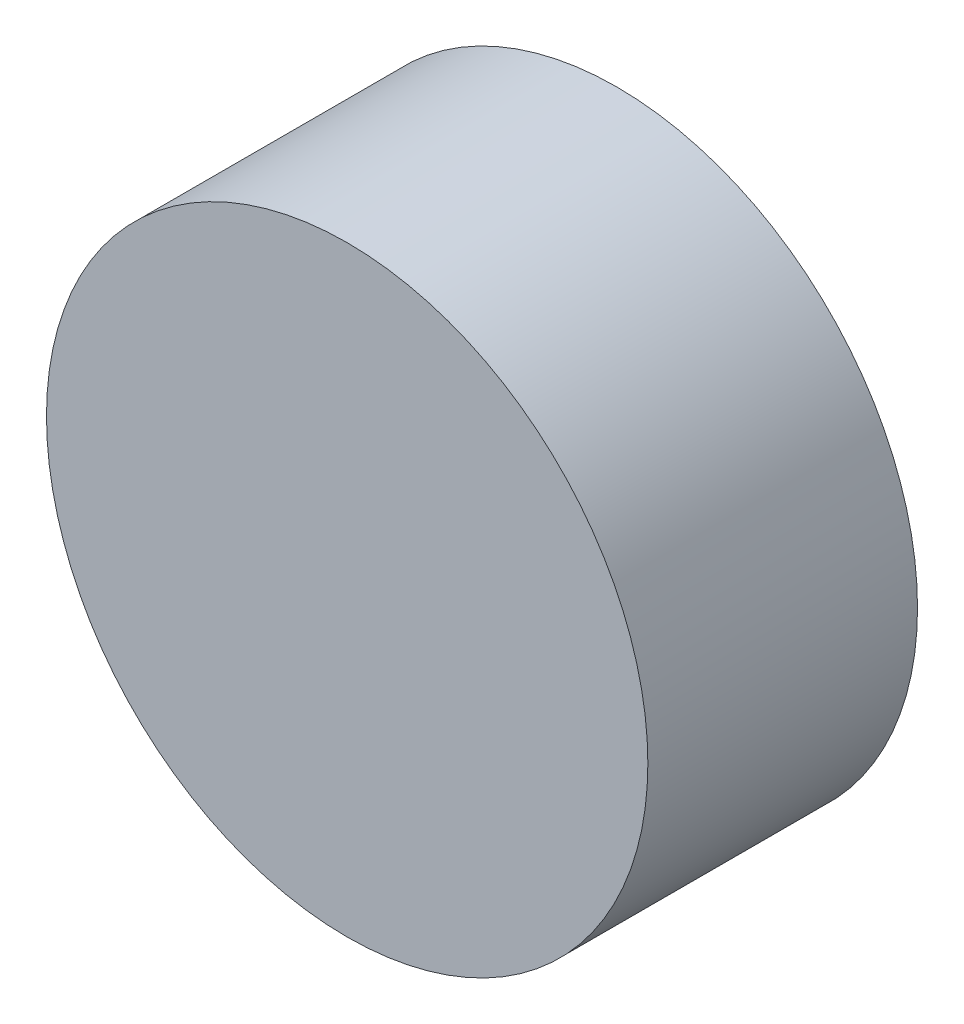
ISO-10303-21;
HEADER;
FILE_DESCRIPTION(('STEP AP214'),'2;1');
FILE_NAME('part.step','',(''),(''),'','','');
FILE_SCHEMA(('AUTOMOTIVE_DESIGN { 1 0 10303 214 1 1 1 1 }'));
ENDSEC;
DATA;
#1=APPLICATION_CONTEXT('core data for automotive mechanical design processes');
#2=APPLICATION_PROTOCOL_DEFINITION('international standard','automotive_design',2000,#1);
#3=PRODUCT_CONTEXT('',#1,'mechanical');
#4=PRODUCT('Part','Part','',(#3));
#5=PRODUCT_RELATED_PRODUCT_CATEGORY('part','',(#4));
#6=PRODUCT_DEFINITION_FORMATION('','',#4);
#7=PRODUCT_DEFINITION_CONTEXT('part definition',#1,'design');
#8=PRODUCT_DEFINITION('design','',#6,#7);
#9=PRODUCT_DEFINITION_SHAPE('','',#8);
#10=(LENGTH_UNIT() NAMED_UNIT(*) SI_UNIT(.MILLI.,.METRE.));
#11=(NAMED_UNIT(*) PLANE_ANGLE_UNIT() SI_UNIT($,.RADIAN.));
#12=(NAMED_UNIT(*) SI_UNIT($,.STERADIAN.) SOLID_ANGLE_UNIT());
#13=UNCERTAINTY_MEASURE_WITH_UNIT(LENGTH_MEASURE(1.E-05),#10,'distance_accuracy_value','');
#14=(GEOMETRIC_REPRESENTATION_CONTEXT(3) GLOBAL_UNCERTAINTY_ASSIGNED_CONTEXT((#13)) GLOBAL_UNIT_ASSIGNED_CONTEXT((#10,
#11,#12)) REPRESENTATION_CONTEXT('',''));
#15=CARTESIAN_POINT('',(0.,0.,0.));
#16=DIRECTION('',(0.,0.,1.));
#17=DIRECTION('',(1.,0.,0.));
#18=AXIS2_PLACEMENT_3D('',#15,#16,#17);
#19=CARTESIAN_POINT('',(0.,0.,205.));
#20=DIRECTION('',(0.,0.,-1.));
#21=DIRECTION('',(-1.,0.,0.));
#22=AXIS2_PLACEMENT_3D('',#19,#20,#21);
#23=CYLINDRICAL_SURFACE('',#22,228.6);
#24=CARTESIAN_POINT('',(0.,0.,205.));
#25=DIRECTION('',(0.,0.,1.));
#26=DIRECTION('',(1.,0.,0.));
#27=AXIS2_PLACEMENT_3D('',#24,#25,#26);
#28=CIRCLE('',#27,228.6);
#29=CARTESIAN_POINT('',(-228.6,0.,205.));
#30=VERTEX_POINT('',#29);
#31=EDGE_CURVE('E10',#30,#30,#28,.T.);
#32=CARTESIAN_POINT('',(0.,0.,0.));
#33=DIRECTION('',(0.,0.,1.));
#34=DIRECTION('',(1.,0.,0.));
#35=AXIS2_PLACEMENT_3D('',#32,#33,#34);
#36=CIRCLE('',#35,228.6);
#37=CARTESIAN_POINT('',(-228.6,0.,0.));
#38=VERTEX_POINT('',#37);
#39=EDGE_CURVE('E34',#38,#38,#36,.T.);
#40=CARTESIAN_POINT('',(-228.6,0.,205.));
#41=CARTESIAN_POINT('',(-228.6,0.,202.864583333333));
#42=CARTESIAN_POINT('',(-228.6,0.,200.729166666667));
#43=CARTESIAN_POINT('',(-228.6,0.,196.458333333333));
#44=CARTESIAN_POINT('',(-228.6,0.,194.322916666667));
#45=CARTESIAN_POINT('',(-228.6,0.,190.052083333333));
#46=CARTESIAN_POINT('',(-228.6,0.,187.916666666667));
#47=CARTESIAN_POINT('',(-228.6,0.,183.645833333333));
#48=CARTESIAN_POINT('',(-228.6,0.,181.510416666667));
#49=CARTESIAN_POINT('',(-228.6,0.,177.239583333333));
#50=CARTESIAN_POINT('',(-228.6,0.,175.104166666667));
#51=CARTESIAN_POINT('',(-228.6,0.,170.833333333333));
#52=CARTESIAN_POINT('',(-228.6,0.,168.697916666667));
#53=CARTESIAN_POINT('',(-228.6,0.,164.427083333333));
#54=CARTESIAN_POINT('',(-228.6,0.,162.291666666667));
#55=CARTESIAN_POINT('',(-228.6,0.,158.020833333333));
#56=CARTESIAN_POINT('',(-228.6,0.,155.885416666667));
#57=CARTESIAN_POINT('',(-228.6,0.,151.614583333333));
#58=CARTESIAN_POINT('',(-228.6,0.,149.479166666667));
#59=CARTESIAN_POINT('',(-228.6,0.,145.208333333333));
#60=CARTESIAN_POINT('',(-228.6,0.,143.072916666667));
#61=CARTESIAN_POINT('',(-228.6,0.,138.802083333333));
#62=CARTESIAN_POINT('',(-228.6,0.,136.666666666667));
#63=CARTESIAN_POINT('',(-228.6,0.,132.395833333333));
#64=CARTESIAN_POINT('',(-228.6,0.,130.260416666667));
#65=CARTESIAN_POINT('',(-228.6,0.,125.989583333333));
#66=CARTESIAN_POINT('',(-228.6,0.,123.854166666667));
#67=CARTESIAN_POINT('',(-228.6,0.,119.583333333333));
#68=CARTESIAN_POINT('',(-228.6,0.,117.447916666667));
#69=CARTESIAN_POINT('',(-228.6,0.,113.177083333333));
#70=CARTESIAN_POINT('',(-228.6,0.,111.041666666667));
#71=CARTESIAN_POINT('',(-228.6,0.,106.770833333333));
#72=CARTESIAN_POINT('',(-228.6,0.,104.635416666667));
#73=CARTESIAN_POINT('',(-228.6,0.,100.364583333333));
#74=CARTESIAN_POINT('',(-228.6,0.,98.2291666666667));
#75=CARTESIAN_POINT('',(-228.6,0.,93.9583333333333));
#76=CARTESIAN_POINT('',(-228.6,0.,91.8229166666667));
#77=CARTESIAN_POINT('',(-228.6,0.,87.5520833333333));
#78=CARTESIAN_POINT('',(-228.6,0.,85.4166666666667));
#79=CARTESIAN_POINT('',(-228.6,0.,81.1458333333333));
#80=CARTESIAN_POINT('',(-228.6,0.,79.0104166666667));
#81=CARTESIAN_POINT('',(-228.6,0.,74.7395833333333));
#82=CARTESIAN_POINT('',(-228.6,0.,72.6041666666667));
#83=CARTESIAN_POINT('',(-228.6,0.,68.3333333333333));
#84=CARTESIAN_POINT('',(-228.6,0.,66.1979166666667));
#85=CARTESIAN_POINT('',(-228.6,0.,61.9270833333333));
#86=CARTESIAN_POINT('',(-228.6,0.,59.7916666666667));
#87=CARTESIAN_POINT('',(-228.6,0.,55.5208333333333));
#88=CARTESIAN_POINT('',(-228.6,0.,53.3854166666667));
#89=CARTESIAN_POINT('',(-228.6,0.,49.1145833333333));
#90=CARTESIAN_POINT('',(-228.6,0.,46.9791666666667));
#91=CARTESIAN_POINT('',(-228.6,0.,42.7083333333333));
#92=CARTESIAN_POINT('',(-228.6,0.,40.5729166666667));
#93=CARTESIAN_POINT('',(-228.6,0.,36.3020833333333));
#94=CARTESIAN_POINT('',(-228.6,0.,34.1666666666667));
#95=CARTESIAN_POINT('',(-228.6,0.,29.8958333333333));
#96=CARTESIAN_POINT('',(-228.6,0.,27.7604166666667));
#97=CARTESIAN_POINT('',(-228.6,0.,23.4895833333333));
#98=CARTESIAN_POINT('',(-228.6,0.,21.3541666666667));
#99=CARTESIAN_POINT('',(-228.6,0.,17.0833333333333));
#100=CARTESIAN_POINT('',(-228.6,0.,14.9479166666667));
#101=CARTESIAN_POINT('',(-228.6,0.,10.6770833333333));
#102=CARTESIAN_POINT('',(-228.6,0.,8.54166666666667));
#103=CARTESIAN_POINT('',(-228.6,0.,4.27083333333333));
#104=CARTESIAN_POINT('',(-228.6,0.,2.13541666666667));
#105=CARTESIAN_POINT('',(-228.6,0.,0.));
#106=B_SPLINE_CURVE_WITH_KNOTS('',3,(#40,#41,#42,#43,#44,#45,#46,#47,#48,#49,#50,#51,#52,#53,
#54,#55,#56,#57,#58,#59,#60,#61,#62,#63,#64,#65,#66,#67,#68,#69,#70,#71,#72,#73,#74,#75,#76,#77,
#78,#79,#80,#81,#82,#83,#84,#85,#86,#87,#88,#89,#90,#91,#92,#93,#94,#95,#96,#97,#98,#99,#100,
#101,#102,#103,#104,#105),.UNSPECIFIED.,.F.,.F.,(4,2,2,2,2,2,2,2,2,2,2,2,2,2,2,2,2,2,2,2,2,2,2,
2,2,2,2,2,2,2,2,2,4),(0.,6.40624999999997,12.8125,19.21875,25.625,32.03125,38.4375,44.84375,
51.25,57.65625,64.0625,70.46875,76.875,83.28125,89.6875,96.09375,102.5,108.90625,115.3125,
121.71875,128.125,134.53125,140.9375,147.34375,153.75,160.15625,166.5625,172.96875,179.375,
185.78125,192.1875,198.59375,205.),.UNSPECIFIED.);
#107=EDGE_CURVE('BSEAM31',#30,#38,#106,.T.);
#108=ORIENTED_EDGE('',*,*,#31,.F.);
#109=ORIENTED_EDGE('',*,*,#39,.T.);
#110=ORIENTED_EDGE('',*,*,#107,.T.);
#111=ORIENTED_EDGE('',*,*,#107,.F.);
#112=EDGE_LOOP('',(#108,#110,#109,#111));
#113=FACE_BOUND('',#112,.T.);
#114=ADVANCED_FACE('F31',(#113),#23,.T.);
#115=CARTESIAN_POINT('',(0.,0.,205.));
#116=DIRECTION('',(0.,0.,1.));
#117=DIRECTION('',(1.,0.,0.));
#118=AXIS2_PLACEMENT_3D('',#115,#116,#117);
#119=PLANE('',#118);
#120=ORIENTED_EDGE('',*,*,#31,.T.);
#121=EDGE_LOOP('',(#120));
#122=FACE_BOUND('',#121,.T.);
#123=ADVANCED_FACE('F46',(#122),#119,.T.);
#124=CARTESIAN_POINT('',(0.,0.,0.));
#125=DIRECTION('',(0.,0.,1.));
#126=DIRECTION('',(1.,0.,0.));
#127=AXIS2_PLACEMENT_3D('',#124,#125,#126);
#128=PLANE('',#127);
#129=ORIENTED_EDGE('',*,*,#39,.F.);
#130=EDGE_LOOP('',(#129));
#131=FACE_BOUND('',#130,.T.);
#132=ADVANCED_FACE('F44',(#131),#128,.F.);
#133=CLOSED_SHELL('',(#114,#123,#132));
#134=MANIFOLD_SOLID_BREP('B2',#133);
#135=ADVANCED_BREP_SHAPE_REPRESENTATION('',(#18,#134),#14);
#136=SHAPE_DEFINITION_REPRESENTATION(#9,#135);
ENDSEC;
END-ISO-10303-21;
